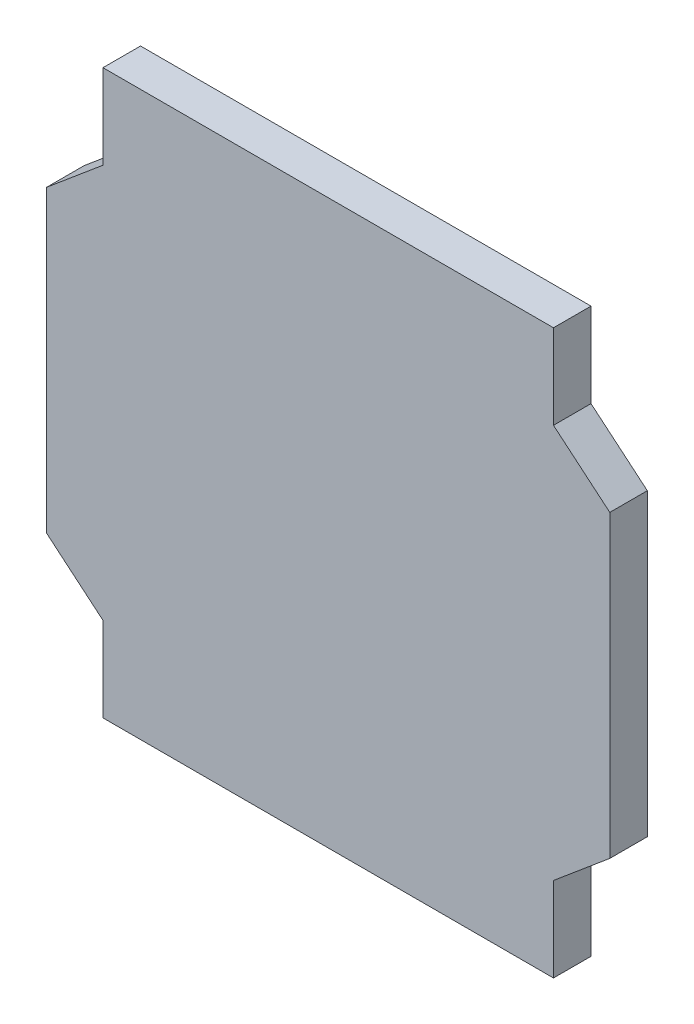
ISO-10303-21;
HEADER;
FILE_DESCRIPTION(('STEP AP214'),'2;1');
FILE_NAME('part.step','',(''),(''),'','','');
FILE_SCHEMA(('AUTOMOTIVE_DESIGN { 1 0 10303 214 1 1 1 1 }'));
ENDSEC;
DATA;
#1=APPLICATION_CONTEXT('core data for automotive mechanical design processes');
#2=APPLICATION_PROTOCOL_DEFINITION('international standard','automotive_design',2000,#1);
#3=PRODUCT_CONTEXT('',#1,'mechanical');
#4=PRODUCT('Part','Part','',(#3));
#5=PRODUCT_RELATED_PRODUCT_CATEGORY('part','',(#4));
#6=PRODUCT_DEFINITION_FORMATION('','',#4);
#7=PRODUCT_DEFINITION_CONTEXT('part definition',#1,'design');
#8=PRODUCT_DEFINITION('design','',#6,#7);
#9=PRODUCT_DEFINITION_SHAPE('','',#8);
#10=(LENGTH_UNIT() NAMED_UNIT(*) SI_UNIT(.MILLI.,.METRE.));
#11=(NAMED_UNIT(*) PLANE_ANGLE_UNIT() SI_UNIT($,.RADIAN.));
#12=(NAMED_UNIT(*) SI_UNIT($,.STERADIAN.) SOLID_ANGLE_UNIT());
#13=UNCERTAINTY_MEASURE_WITH_UNIT(LENGTH_MEASURE(1.E-05),#10,'distance_accuracy_value','');
#14=(GEOMETRIC_REPRESENTATION_CONTEXT(3) GLOBAL_UNCERTAINTY_ASSIGNED_CONTEXT((#13)) GLOBAL_UNIT_ASSIGNED_CONTEXT((#10,
#11,#12)) REPRESENTATION_CONTEXT('',''));
#15=CARTESIAN_POINT('',(0.,0.,0.));
#16=DIRECTION('',(0.,0.,1.));
#17=DIRECTION('',(1.,0.,0.));
#18=AXIS2_PLACEMENT_3D('',#15,#16,#17);
#19=CARTESIAN_POINT('',(0.,0.,0.3));
#20=DIRECTION('',(0.,0.,1.));
#21=DIRECTION('',(1.,0.,0.));
#22=AXIS2_PLACEMENT_3D('',#19,#20,#21);
#23=PLANE('',#22);
#24=DIRECTION('',(0.,1.,0.));
#25=VECTOR('',#24,1.);
#26=CARTESIAN_POINT('',(-1.5,-0.798270110647,0.3));
#27=LINE('',#26,#25);
#28=CARTESIAN_POINT('',(-1.5,-0.798270110647,0.3));
#29=VERTEX_POINT('',#28);
#30=CARTESIAN_POINT('',(-1.5,0.798270110647,0.3));
#31=VERTEX_POINT('',#30);
#32=EDGE_CURVE('E162',#29,#31,#27,.T.);
#33=ORIENTED_EDGE('',*,*,#32,.F.);
#34=DIRECTION('',(0.76604444311876,-0.642787609686799,0.));
#35=VECTOR('',#34,1.);
#36=CARTESIAN_POINT('',(-1.5,-0.798270110647,0.3));
#37=LINE('',#36,#35);
#38=CARTESIAN_POINT('',(-1.2,-1.05,0.3));
#39=VERTEX_POINT('',#38);
#40=EDGE_CURVE('E293',#29,#39,#37,.T.);
#41=ORIENTED_EDGE('',*,*,#40,.T.);
#42=DIRECTION('',(0.,1.,0.));
#43=VECTOR('',#42,1.);
#44=CARTESIAN_POINT('',(-1.2,-1.5,0.3));
#45=LINE('',#44,#43);
#46=CARTESIAN_POINT('',(-1.2,-1.5,0.3));
#47=VERTEX_POINT('',#46);
#48=EDGE_CURVE('E11',#47,#39,#45,.T.);
#49=ORIENTED_EDGE('',*,*,#48,.F.);
#50=DIRECTION('',(-1.,0.,0.));
#51=VECTOR('',#50,1.);
#52=CARTESIAN_POINT('',(1.2,-1.5,0.3));
#53=LINE('',#52,#51);
#54=CARTESIAN_POINT('',(1.2,-1.5,0.3));
#55=VERTEX_POINT('',#54);
#56=EDGE_CURVE('E42',#55,#47,#53,.T.);
#57=ORIENTED_EDGE('',*,*,#56,.F.);
#58=DIRECTION('',(0.,-1.,0.));
#59=VECTOR('',#58,1.);
#60=CARTESIAN_POINT('',(1.2,-1.05,0.3));
#61=LINE('',#60,#59);
#62=CARTESIAN_POINT('',(1.2,-1.05,0.3));
#63=VERTEX_POINT('',#62);
#64=EDGE_CURVE('E166',#63,#55,#61,.T.);
#65=ORIENTED_EDGE('',*,*,#64,.F.);
#66=DIRECTION('',(0.76604444311876,0.642787609686799,0.));
#67=VECTOR('',#66,1.);
#68=CARTESIAN_POINT('',(1.2,-1.05,0.3));
#69=LINE('',#68,#67);
#70=CARTESIAN_POINT('',(1.5,-0.798270110647,0.3));
#71=VERTEX_POINT('',#70);
#72=EDGE_CURVE('E197',#63,#71,#69,.T.);
#73=ORIENTED_EDGE('',*,*,#72,.T.);
#74=DIRECTION('',(0.,-1.,0.));
#75=VECTOR('',#74,1.);
#76=CARTESIAN_POINT('',(1.5,0.798270110647,0.3));
#77=LINE('',#76,#75);
#78=CARTESIAN_POINT('',(1.5,0.798270110647,0.3));
#79=VERTEX_POINT('',#78);
#80=EDGE_CURVE('E192',#79,#71,#77,.T.);
#81=ORIENTED_EDGE('',*,*,#80,.F.);
#82=DIRECTION('',(-0.76604444311876,0.642787609686799,0.));
#83=VECTOR('',#82,1.);
#84=CARTESIAN_POINT('',(1.5,0.798270110647,0.3));
#85=LINE('',#84,#83);
#86=CARTESIAN_POINT('',(1.2,1.05,0.3));
#87=VERTEX_POINT('',#86);
#88=EDGE_CURVE('E188',#79,#87,#85,.T.);
#89=ORIENTED_EDGE('',*,*,#88,.T.);
#90=DIRECTION('',(0.,-1.,0.));
#91=VECTOR('',#90,1.);
#92=CARTESIAN_POINT('',(1.2,1.5,0.3));
#93=LINE('',#92,#91);
#94=CARTESIAN_POINT('',(1.2,1.5,0.3));
#95=VERTEX_POINT('',#94);
#96=EDGE_CURVE('E180',#95,#87,#93,.T.);
#97=ORIENTED_EDGE('',*,*,#96,.F.);
#98=DIRECTION('',(1.,0.,0.));
#99=VECTOR('',#98,1.);
#100=CARTESIAN_POINT('',(-1.2,1.5,0.3));
#101=LINE('',#100,#99);
#102=CARTESIAN_POINT('',(-1.2,1.5,0.3));
#103=VERTEX_POINT('',#102);
#104=EDGE_CURVE('E137',#103,#95,#101,.T.);
#105=ORIENTED_EDGE('',*,*,#104,.F.);
#106=DIRECTION('',(0.,1.,0.));
#107=VECTOR('',#106,1.);
#108=CARTESIAN_POINT('',(-1.2,1.05,0.3));
#109=LINE('',#108,#107);
#110=CARTESIAN_POINT('',(-1.2,1.05,0.3));
#111=VERTEX_POINT('',#110);
#112=EDGE_CURVE('E131',#111,#103,#109,.T.);
#113=ORIENTED_EDGE('',*,*,#112,.F.);
#114=DIRECTION('',(-0.76604444311876,-0.642787609686799,0.));
#115=VECTOR('',#114,1.);
#116=CARTESIAN_POINT('',(-1.2,1.05,0.3));
#117=LINE('',#116,#115);
#118=EDGE_CURVE('E134',#111,#31,#117,.T.);
#119=ORIENTED_EDGE('',*,*,#118,.T.);
#120=EDGE_LOOP('',(#33,#41,#49,#57,#65,#73,#81,#89,#97,#105,#113,#119));
#121=FACE_BOUND('',#120,.T.);
#122=ADVANCED_FACE('F17',(#121),#23,.T.);
#123=CARTESIAN_POINT('',(-1.2,-1.05,0.3));
#124=DIRECTION('',(1.,0.,0.));
#125=DIRECTION('',(0.,1.,0.));
#126=AXIS2_PLACEMENT_3D('',#123,#124,#125);
#127=PLANE('',#126);
#128=DIRECTION('',(0.,1.,0.));
#129=VECTOR('',#128,1.);
#130=CARTESIAN_POINT('',(-1.2,-1.5,0.1));
#131=LINE('',#130,#129);
#132=CARTESIAN_POINT('',(-1.2,-1.5,0.1));
#133=VERTEX_POINT('',#132);
#134=CARTESIAN_POINT('',(-1.2,-1.05,0.1));
#135=VERTEX_POINT('',#134);
#136=EDGE_CURVE('E216',#133,#135,#131,.T.);
#137=ORIENTED_EDGE('',*,*,#136,.F.);
#138=DIRECTION('',(0.,0.,1.));
#139=VECTOR('',#138,1.);
#140=CARTESIAN_POINT('',(-1.2,-1.5,0.1));
#141=LINE('',#140,#139);
#142=EDGE_CURVE('E25',#133,#47,#141,.T.);
#143=ORIENTED_EDGE('',*,*,#142,.T.);
#144=ORIENTED_EDGE('',*,*,#48,.T.);
#145=DIRECTION('',(0.,0.,1.));
#146=VECTOR('',#145,1.);
#147=CARTESIAN_POINT('',(-1.2,-1.05,0.1));
#148=LINE('',#147,#146);
#149=EDGE_CURVE('E290',#135,#39,#148,.T.);
#150=ORIENTED_EDGE('',*,*,#149,.F.);
#151=EDGE_LOOP('',(#137,#143,#144,#150));
#152=FACE_BOUND('',#151,.T.);
#153=ADVANCED_FACE('F214',(#152),#127,.F.);
#154=CARTESIAN_POINT('',(-1.2,-1.5,0.3));
#155=DIRECTION('',(0.,1.,0.));
#156=DIRECTION('',(1.,0.,0.));
#157=AXIS2_PLACEMENT_3D('',#154,#155,#156);
#158=PLANE('',#157);
#159=DIRECTION('',(-1.,0.,0.));
#160=VECTOR('',#159,1.);
#161=CARTESIAN_POINT('',(1.2,-1.5,0.1));
#162=LINE('',#161,#160);
#163=CARTESIAN_POINT('',(1.2,-1.5,0.1));
#164=VERTEX_POINT('',#163);
#165=EDGE_CURVE('E221',#164,#133,#162,.T.);
#166=ORIENTED_EDGE('',*,*,#165,.F.);
#167=DIRECTION('',(0.,0.,1.));
#168=VECTOR('',#167,1.);
#169=CARTESIAN_POINT('',(1.2,-1.5,0.1));
#170=LINE('',#169,#168);
#171=EDGE_CURVE('E170',#164,#55,#170,.T.);
#172=ORIENTED_EDGE('',*,*,#171,.T.);
#173=ORIENTED_EDGE('',*,*,#56,.T.);
#174=ORIENTED_EDGE('',*,*,#142,.F.);
#175=EDGE_LOOP('',(#166,#172,#173,#174));
#176=FACE_BOUND('',#175,.T.);
#177=ADVANCED_FACE('F220',(#176),#158,.F.);
#178=CARTESIAN_POINT('',(1.2,-1.05,0.3));
#179=DIRECTION('',(-1.,0.,0.));
#180=DIRECTION('',(0.,0.,1.));
#181=AXIS2_PLACEMENT_3D('',#178,#179,#180);
#182=PLANE('',#181);
#183=DIRECTION('',(0.,-1.,0.));
#184=VECTOR('',#183,1.);
#185=CARTESIAN_POINT('',(1.2,-1.05,0.1));
#186=LINE('',#185,#184);
#187=CARTESIAN_POINT('',(1.2,-1.05,0.1));
#188=VERTEX_POINT('',#187);
#189=EDGE_CURVE('E280',#188,#164,#186,.T.);
#190=ORIENTED_EDGE('',*,*,#189,.F.);
#191=DIRECTION('',(0.,0.,1.));
#192=VECTOR('',#191,1.);
#193=CARTESIAN_POINT('',(1.2,-1.05,0.1));
#194=LINE('',#193,#192);
#195=EDGE_CURVE('E171',#188,#63,#194,.T.);
#196=ORIENTED_EDGE('',*,*,#195,.T.);
#197=ORIENTED_EDGE('',*,*,#64,.T.);
#198=ORIENTED_EDGE('',*,*,#171,.F.);
#199=EDGE_LOOP('',(#190,#196,#197,#198));
#200=FACE_BOUND('',#199,.T.);
#201=ADVANCED_FACE('F225',(#200),#182,.F.);
#202=CARTESIAN_POINT('',(1.5,-0.798270110647,0.3));
#203=DIRECTION('',(-0.642787609686799,0.76604444311876,0.));
#204=DIRECTION('',(0.,0.,1.));
#205=AXIS2_PLACEMENT_3D('',#202,#203,#204);
#206=PLANE('',#205);
#207=DIRECTION('',(-0.76604444311876,-0.642787609686799,0.));
#208=VECTOR('',#207,1.);
#209=CARTESIAN_POINT('',(1.5,-0.798270110647,0.1));
#210=LINE('',#209,#208);
#211=CARTESIAN_POINT('',(1.5,-0.798270110647,0.1));
#212=VERTEX_POINT('',#211);
#213=EDGE_CURVE('E232',#212,#188,#210,.T.);
#214=ORIENTED_EDGE('',*,*,#213,.F.);
#215=DIRECTION('',(0.,0.,1.));
#216=VECTOR('',#215,1.);
#217=CARTESIAN_POINT('',(1.5,-0.798270110647,0.1));
#218=LINE('',#217,#216);
#219=EDGE_CURVE('E196',#212,#71,#218,.T.);
#220=ORIENTED_EDGE('',*,*,#219,.T.);
#221=ORIENTED_EDGE('',*,*,#72,.F.);
#222=ORIENTED_EDGE('',*,*,#195,.F.);
#223=EDGE_LOOP('',(#214,#220,#221,#222));
#224=FACE_BOUND('',#223,.T.);
#225=ADVANCED_FACE('F230',(#224),#206,.F.);
#226=CARTESIAN_POINT('',(1.5,0.798270110647,0.3));
#227=DIRECTION('',(-1.,0.,0.));
#228=DIRECTION('',(0.,0.,1.));
#229=AXIS2_PLACEMENT_3D('',#226,#227,#228);
#230=PLANE('',#229);
#231=DIRECTION('',(0.,-1.,0.));
#232=VECTOR('',#231,1.);
#233=CARTESIAN_POINT('',(1.5,0.798270110647,0.1));
#234=LINE('',#233,#232);
#235=CARTESIAN_POINT('',(1.5,0.798270110647,0.1));
#236=VERTEX_POINT('',#235);
#237=EDGE_CURVE('E238',#236,#212,#234,.T.);
#238=ORIENTED_EDGE('',*,*,#237,.F.);
#239=DIRECTION('',(0.,0.,1.));
#240=VECTOR('',#239,1.);
#241=CARTESIAN_POINT('',(1.5,0.798270110647,0.1));
#242=LINE('',#241,#240);
#243=EDGE_CURVE('E191',#236,#79,#242,.T.);
#244=ORIENTED_EDGE('',*,*,#243,.T.);
#245=ORIENTED_EDGE('',*,*,#80,.T.);
#246=ORIENTED_EDGE('',*,*,#219,.F.);
#247=EDGE_LOOP('',(#238,#244,#245,#246));
#248=FACE_BOUND('',#247,.T.);
#249=ADVANCED_FACE('F236',(#248),#230,.F.);
#250=CARTESIAN_POINT('',(1.5,0.798270110647,0.3));
#251=DIRECTION('',(-0.642787609686799,-0.76604444311876,0.));
#252=DIRECTION('',(-0.76604444311876,0.642787609686799,0.));
#253=AXIS2_PLACEMENT_3D('',#250,#251,#252);
#254=PLANE('',#253);
#255=DIRECTION('',(0.76604444311876,-0.642787609686799,0.));
#256=VECTOR('',#255,1.);
#257=CARTESIAN_POINT('',(1.2,1.05,0.1));
#258=LINE('',#257,#256);
#259=CARTESIAN_POINT('',(1.2,1.05,0.1));
#260=VERTEX_POINT('',#259);
#261=EDGE_CURVE('E269',#260,#236,#258,.T.);
#262=ORIENTED_EDGE('',*,*,#261,.F.);
#263=DIRECTION('',(0.,0.,1.));
#264=VECTOR('',#263,1.);
#265=CARTESIAN_POINT('',(1.2,1.05,0.1));
#266=LINE('',#265,#264);
#267=EDGE_CURVE('E184',#260,#87,#266,.T.);
#268=ORIENTED_EDGE('',*,*,#267,.T.);
#269=ORIENTED_EDGE('',*,*,#88,.F.);
#270=ORIENTED_EDGE('',*,*,#243,.F.);
#271=EDGE_LOOP('',(#262,#268,#269,#270));
#272=FACE_BOUND('',#271,.T.);
#273=ADVANCED_FACE('F244',(#272),#254,.F.);
#274=CARTESIAN_POINT('',(1.2,1.05,0.3));
#275=DIRECTION('',(-1.,0.,0.));
#276=DIRECTION('',(0.,0.,1.));
#277=AXIS2_PLACEMENT_3D('',#274,#275,#276);
#278=PLANE('',#277);
#279=DIRECTION('',(0.,-1.,0.));
#280=VECTOR('',#279,1.);
#281=CARTESIAN_POINT('',(1.2,1.5,0.1));
#282=LINE('',#281,#280);
#283=CARTESIAN_POINT('',(1.2,1.5,0.1));
#284=VERTEX_POINT('',#283);
#285=EDGE_CURVE('E249',#284,#260,#282,.T.);
#286=ORIENTED_EDGE('',*,*,#285,.F.);
#287=DIRECTION('',(0.,0.,1.));
#288=VECTOR('',#287,1.);
#289=CARTESIAN_POINT('',(1.2,1.5,0.1));
#290=LINE('',#289,#288);
#291=EDGE_CURVE('E176',#284,#95,#290,.T.);
#292=ORIENTED_EDGE('',*,*,#291,.T.);
#293=ORIENTED_EDGE('',*,*,#96,.T.);
#294=ORIENTED_EDGE('',*,*,#267,.F.);
#295=EDGE_LOOP('',(#286,#292,#293,#294));
#296=FACE_BOUND('',#295,.T.);
#297=ADVANCED_FACE('F247',(#296),#278,.F.);
#298=CARTESIAN_POINT('',(-1.2,1.5,0.3));
#299=DIRECTION('',(0.,-1.,0.));
#300=DIRECTION('',(0.,0.,-1.));
#301=AXIS2_PLACEMENT_3D('',#298,#299,#300);
#302=PLANE('',#301);
#303=DIRECTION('',(1.,0.,0.));
#304=VECTOR('',#303,1.);
#305=CARTESIAN_POINT('',(-1.2,1.5,0.1));
#306=LINE('',#305,#304);
#307=CARTESIAN_POINT('',(-1.2,1.5,0.1));
#308=VERTEX_POINT('',#307);
#309=EDGE_CURVE('E254',#308,#284,#306,.T.);
#310=ORIENTED_EDGE('',*,*,#309,.F.);
#311=DIRECTION('',(0.,0.,1.));
#312=VECTOR('',#311,1.);
#313=CARTESIAN_POINT('',(-1.2,1.5,0.1));
#314=LINE('',#313,#312);
#315=EDGE_CURVE('E141',#308,#103,#314,.T.);
#316=ORIENTED_EDGE('',*,*,#315,.T.);
#317=ORIENTED_EDGE('',*,*,#104,.T.);
#318=ORIENTED_EDGE('',*,*,#291,.F.);
#319=EDGE_LOOP('',(#310,#316,#317,#318));
#320=FACE_BOUND('',#319,.T.);
#321=ADVANCED_FACE('F253',(#320),#302,.F.);
#322=CARTESIAN_POINT('',(-1.2,1.05,0.3));
#323=DIRECTION('',(1.,0.,0.));
#324=DIRECTION('',(0.,1.,0.));
#325=AXIS2_PLACEMENT_3D('',#322,#323,#324);
#326=PLANE('',#325);
#327=DIRECTION('',(0.,1.,0.));
#328=VECTOR('',#327,1.);
#329=CARTESIAN_POINT('',(-1.2,1.05,0.1));
#330=LINE('',#329,#328);
#331=CARTESIAN_POINT('',(-1.2,1.05,0.1));
#332=VERTEX_POINT('',#331);
#333=EDGE_CURVE('E147',#332,#308,#330,.T.);
#334=ORIENTED_EDGE('',*,*,#333,.F.);
#335=DIRECTION('',(0.,0.,1.));
#336=VECTOR('',#335,1.);
#337=CARTESIAN_POINT('',(-1.2,1.05,0.1));
#338=LINE('',#337,#336);
#339=EDGE_CURVE('E142',#332,#111,#338,.T.);
#340=ORIENTED_EDGE('',*,*,#339,.T.);
#341=ORIENTED_EDGE('',*,*,#112,.T.);
#342=ORIENTED_EDGE('',*,*,#315,.F.);
#343=EDGE_LOOP('',(#334,#340,#341,#342));
#344=FACE_BOUND('',#343,.T.);
#345=ADVANCED_FACE('F145',(#344),#326,.F.);
#346=CARTESIAN_POINT('',(-1.5,0.798270110647,0.3));
#347=DIRECTION('',(0.642787609686799,-0.76604444311876,0.));
#348=DIRECTION('',(0.,0.,-1.));
#349=AXIS2_PLACEMENT_3D('',#346,#347,#348);
#350=PLANE('',#349);
#351=DIRECTION('',(0.76604444311876,0.642787609686799,0.));
#352=VECTOR('',#351,1.);
#353=CARTESIAN_POINT('',(-1.5,0.798270110647,0.1));
#354=LINE('',#353,#352);
#355=CARTESIAN_POINT('',(-1.5,0.798270110647,0.1));
#356=VERTEX_POINT('',#355);
#357=EDGE_CURVE('E260',#356,#332,#354,.T.);
#358=ORIENTED_EDGE('',*,*,#357,.F.);
#359=DIRECTION('',(0.,0.,1.));
#360=VECTOR('',#359,1.);
#361=CARTESIAN_POINT('',(-1.5,0.798270110647,0.1));
#362=LINE('',#361,#360);
#363=EDGE_CURVE('E154',#356,#31,#362,.T.);
#364=ORIENTED_EDGE('',*,*,#363,.T.);
#365=ORIENTED_EDGE('',*,*,#118,.F.);
#366=ORIENTED_EDGE('',*,*,#339,.F.);
#367=EDGE_LOOP('',(#358,#364,#365,#366));
#368=FACE_BOUND('',#367,.T.);
#369=ADVANCED_FACE('F153',(#368),#350,.F.);
#370=CARTESIAN_POINT('',(-1.5,0.798270110647,0.3));
#371=DIRECTION('',(1.,0.,0.));
#372=DIRECTION('',(0.,1.,0.));
#373=AXIS2_PLACEMENT_3D('',#370,#371,#372);
#374=PLANE('',#373);
#375=DIRECTION('',(0.,1.,0.));
#376=VECTOR('',#375,1.);
#377=CARTESIAN_POINT('',(-1.5,-0.798270110647,0.1));
#378=LINE('',#377,#376);
#379=CARTESIAN_POINT('',(-1.5,-0.798270110647,0.1));
#380=VERTEX_POINT('',#379);
#381=EDGE_CURVE('E266',#380,#356,#378,.T.);
#382=ORIENTED_EDGE('',*,*,#381,.F.);
#383=DIRECTION('',(0.,0.,1.));
#384=VECTOR('',#383,1.);
#385=CARTESIAN_POINT('',(-1.5,-0.798270110647,0.1));
#386=LINE('',#385,#384);
#387=EDGE_CURVE('E297',#380,#29,#386,.T.);
#388=ORIENTED_EDGE('',*,*,#387,.T.);
#389=ORIENTED_EDGE('',*,*,#32,.T.);
#390=ORIENTED_EDGE('',*,*,#363,.F.);
#391=EDGE_LOOP('',(#382,#388,#389,#390));
#392=FACE_BOUND('',#391,.T.);
#393=ADVANCED_FACE('F306',(#392),#374,.F.);
#394=CARTESIAN_POINT('',(0.,0.,0.1));
#395=DIRECTION('',(0.,0.,1.));
#396=DIRECTION('',(1.,0.,0.));
#397=AXIS2_PLACEMENT_3D('',#394,#395,#396);
#398=PLANE('',#397);
#399=ORIENTED_EDGE('',*,*,#381,.T.);
#400=ORIENTED_EDGE('',*,*,#357,.T.);
#401=ORIENTED_EDGE('',*,*,#333,.T.);
#402=ORIENTED_EDGE('',*,*,#309,.T.);
#403=ORIENTED_EDGE('',*,*,#285,.T.);
#404=ORIENTED_EDGE('',*,*,#261,.T.);
#405=ORIENTED_EDGE('',*,*,#237,.T.);
#406=ORIENTED_EDGE('',*,*,#213,.T.);
#407=ORIENTED_EDGE('',*,*,#189,.T.);
#408=ORIENTED_EDGE('',*,*,#165,.T.);
#409=ORIENTED_EDGE('',*,*,#136,.T.);
#410=DIRECTION('',(-0.76604444311876,0.642787609686799,0.));
#411=VECTOR('',#410,1.);
#412=CARTESIAN_POINT('',(-1.2,-1.05,0.1));
#413=LINE('',#412,#411);
#414=EDGE_CURVE('E288',#135,#380,#413,.T.);
#415=ORIENTED_EDGE('',*,*,#414,.T.);
#416=EDGE_LOOP('',(#399,#400,#401,#402,#403,#404,#405,#406,#407,#408,#409,#415));
#417=FACE_BOUND('',#416,.T.);
#418=ADVANCED_FACE('F259',(#417),#398,.F.);
#419=CARTESIAN_POINT('',(-1.5,-0.798270110647,0.3));
#420=DIRECTION('',(0.642787609686799,0.76604444311876,0.));
#421=DIRECTION('',(0.,0.,-1.));
#422=AXIS2_PLACEMENT_3D('',#419,#420,#421);
#423=PLANE('',#422);
#424=ORIENTED_EDGE('',*,*,#414,.F.);
#425=ORIENTED_EDGE('',*,*,#149,.T.);
#426=ORIENTED_EDGE('',*,*,#40,.F.);
#427=ORIENTED_EDGE('',*,*,#387,.F.);
#428=EDGE_LOOP('',(#424,#425,#426,#427));
#429=FACE_BOUND('',#428,.T.);
#430=ADVANCED_FACE('F309',(#429),#423,.F.);
#431=CLOSED_SHELL('',(#122,#153,#177,#201,#225,#249,#273,#297,#321,#345,#369,#393,#418,#430));
#432=MANIFOLD_SOLID_BREP('B1',#431);
#433=ADVANCED_BREP_SHAPE_REPRESENTATION('',(#18,#432),#14);
#434=SHAPE_DEFINITION_REPRESENTATION(#9,#433);
ENDSEC;
END-ISO-10303-21;
